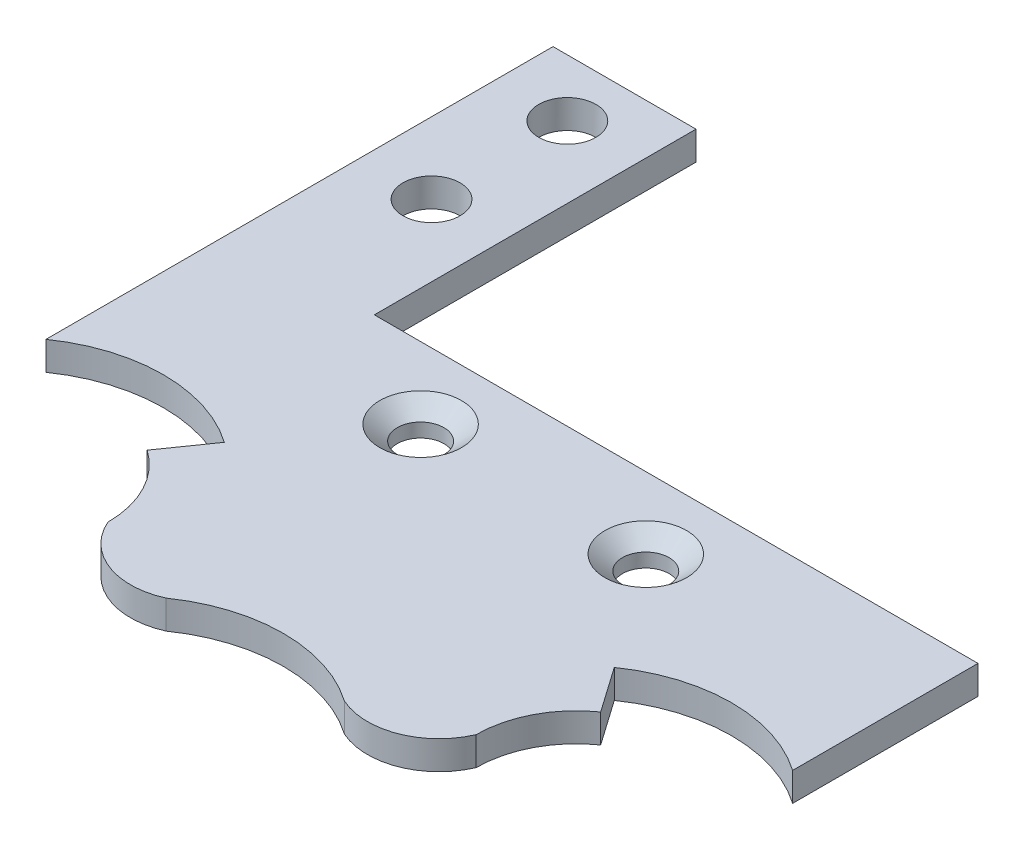
ISO-10303-21;
HEADER;
FILE_DESCRIPTION(('STEP AP214'),'2;1');
FILE_NAME('part.step','',(''),(''),'','','');
FILE_SCHEMA(('AUTOMOTIVE_DESIGN { 1 0 10303 214 1 1 1 1 }'));
ENDSEC;
DATA;
#1=APPLICATION_CONTEXT('core data for automotive mechanical design processes');
#2=APPLICATION_PROTOCOL_DEFINITION('international standard','automotive_design',2000,#1);
#3=PRODUCT_CONTEXT('',#1,'mechanical');
#4=PRODUCT('Part','Part','',(#3));
#5=PRODUCT_RELATED_PRODUCT_CATEGORY('part','',(#4));
#6=PRODUCT_DEFINITION_FORMATION('','',#4);
#7=PRODUCT_DEFINITION_CONTEXT('part definition',#1,'design');
#8=PRODUCT_DEFINITION('design','',#6,#7);
#9=PRODUCT_DEFINITION_SHAPE('','',#8);
#10=(LENGTH_UNIT() NAMED_UNIT(*) SI_UNIT(.MILLI.,.METRE.));
#11=(NAMED_UNIT(*) PLANE_ANGLE_UNIT() SI_UNIT($,.RADIAN.));
#12=(NAMED_UNIT(*) SI_UNIT($,.STERADIAN.) SOLID_ANGLE_UNIT());
#13=UNCERTAINTY_MEASURE_WITH_UNIT(LENGTH_MEASURE(1.E-05),#10,'distance_accuracy_value','');
#14=(GEOMETRIC_REPRESENTATION_CONTEXT(3) GLOBAL_UNCERTAINTY_ASSIGNED_CONTEXT((#13)) GLOBAL_UNIT_ASSIGNED_CONTEXT((#10,
#11,#12)) REPRESENTATION_CONTEXT('',''));
#15=CARTESIAN_POINT('',(0.,0.,0.));
#16=DIRECTION('',(0.,0.,1.));
#17=DIRECTION('',(1.,0.,0.));
#18=AXIS2_PLACEMENT_3D('',#15,#16,#17);
#19=CARTESIAN_POINT('',(-19.8752830168529,1.,-11.4749999999999));
#20=DIRECTION('',(0.,-1.,0.));
#21=DIRECTION('',(0.,0.,-1.));
#22=AXIS2_PLACEMENT_3D('',#19,#20,#21);
#23=PLANE('',#22);
#24=CARTESIAN_POINT('',(-7.87528301685294,1.,-28.3499999999999));
#25=DIRECTION('',(0.,-1.,0.));
#26=DIRECTION('',(0.,0.,-1.));
#27=AXIS2_PLACEMENT_3D('',#24,#25,#26);
#28=CIRCLE('',#27,1.63195);
#29=CARTESIAN_POINT('',(-7.87528301685294,1.,-29.9819499999999));
#30=VERTEX_POINT('',#29);
#31=EDGE_CURVE('E438',#30,#30,#28,.F.);
#32=ORIENTED_EDGE('',*,*,#31,.T.);
#33=EDGE_LOOP('',(#32));
#34=FACE_BOUND('',#33,.T.);
#35=CARTESIAN_POINT('',(-19.8752830168529,1.,-11.4749999999999));
#36=DIRECTION('',(0.,-1.,0.));
#37=DIRECTION('',(0.,0.,-1.));
#38=AXIS2_PLACEMENT_3D('',#35,#36,#37);
#39=CIRCLE('',#38,10.875);
#40=CARTESIAN_POINT('',(-26.1129267621705,1.,-20.3832784816427));
#41=VERTEX_POINT('',#40);
#42=CARTESIAN_POINT('',(-13.6376392715353,1.,-20.3832784816427));
#43=VERTEX_POINT('',#42);
#44=EDGE_CURVE('E128',#41,#43,#39,.T.);
#45=ORIENTED_EDGE('',*,*,#44,.F.);
#46=DIRECTION('',(0.,0.,-1.));
#47=VECTOR('',#46,1.);
#48=CARTESIAN_POINT('',(-26.1129267621705,1.,-11.4749999999999));
#49=LINE('',#48,#47);
#50=CARTESIAN_POINT('',(-26.1129267621705,1.,-55.8499999999999));
#51=VERTEX_POINT('',#50);
#52=EDGE_CURVE('E141',#51,#41,#49,.F.);
#53=ORIENTED_EDGE('',*,*,#52,.F.);
#54=DIRECTION('',(1.,0.,0.));
#55=VECTOR('',#54,1.);
#56=CARTESIAN_POINT('',(-19.8752830168529,1.,-55.8499999999999));
#57=LINE('',#56,#55);
#58=CARTESIAN_POINT('',(-16.1129267621705,1.,-55.8499999999999));
#59=VERTEX_POINT('',#58);
#60=EDGE_CURVE('E144',#59,#51,#57,.F.);
#61=ORIENTED_EDGE('',*,*,#60,.F.);
#62=DIRECTION('',(0.,0.,-1.));
#63=VECTOR('',#62,1.);
#64=CARTESIAN_POINT('',(-16.1129267621705,1.,-11.4749999999999));
#65=LINE('',#64,#63);
#66=CARTESIAN_POINT('',(-16.1129267621705,1.,-33.3499999999999));
#67=VERTEX_POINT('',#66);
#68=EDGE_CURVE('E147',#67,#59,#65,.T.);
#69=ORIENTED_EDGE('',*,*,#68,.F.);
#70=DIRECTION('',(1.,0.,0.));
#71=VECTOR('',#70,1.);
#72=CARTESIAN_POINT('',(-19.8752830168529,1.,-33.3499999999999));
#73=LINE('',#72,#71);
#74=CARTESIAN_POINT('',(26.1129267621705,1.,-33.3499999999999));
#75=VERTEX_POINT('',#74);
#76=EDGE_CURVE('E150',#75,#67,#73,.F.);
#77=ORIENTED_EDGE('',*,*,#76,.F.);
#78=DIRECTION('',(0.,0.,-1.));
#79=VECTOR('',#78,1.);
#80=CARTESIAN_POINT('',(26.1129267621705,1.,-11.4749999999999));
#81=LINE('',#80,#79);
#82=CARTESIAN_POINT('',(26.1129267621705,1.,-20.3832784816427));
#83=VERTEX_POINT('',#82);
#84=EDGE_CURVE('E153',#83,#75,#81,.T.);
#85=ORIENTED_EDGE('',*,*,#84,.F.);
#86=CARTESIAN_POINT('',(19.8752830168529,1.,-11.4749999999998));
#87=DIRECTION('',(0.,-1.,0.));
#88=DIRECTION('',(0.,0.,-1.));
#89=AXIS2_PLACEMENT_3D('',#86,#87,#88);
#90=CIRCLE('',#89,10.875);
#91=CARTESIAN_POINT('',(13.6376392715353,1.,-20.3832784816427));
#92=VERTEX_POINT('',#91);
#93=EDGE_CURVE('E156',#92,#83,#90,.T.);
#94=ORIENTED_EDGE('',*,*,#93,.F.);
#95=DIRECTION('',(-0.573576436351044,0.,-0.819152044288993));
#96=VECTOR('',#95,1.);
#97=CARTESIAN_POINT('',(15.8602479623956,1.,-17.2090643100228));
#98=LINE('',#97,#96);
#99=CARTESIAN_POINT('',(15.8602479623956,1.,-17.2090643100228));
#100=VERTEX_POINT('',#99);
#101=EDGE_CURVE('E159',#100,#92,#98,.T.);
#102=ORIENTED_EDGE('',*,*,#101,.F.);
#103=CARTESIAN_POINT('',(19.875283016853,1.,-11.4749999999998));
#104=DIRECTION('',(0.,-1.,0.));
#105=DIRECTION('',(0.,0.,-1.));
#106=AXIS2_PLACEMENT_3D('',#103,#104,#105);
#107=CIRCLE('',#106,7.0000000000001);
#108=CARTESIAN_POINT('',(12.8752830168529,1.,-11.4749999999998));
#109=VERTEX_POINT('',#108);
#110=EDGE_CURVE('E162',#109,#100,#107,.T.);
#111=ORIENTED_EDGE('',*,*,#110,.F.);
#112=CARTESIAN_POINT('',(8.28958586898089,1.,-13.4678325740005));
#113=DIRECTION('',(0.,1.,0.));
#114=DIRECTION('',(0.,0.,1.));
#115=AXIS2_PLACEMENT_3D('',#112,#113,#114);
#116=CIRCLE('',#115,5.00000000000001);
#117=CARTESIAN_POINT('',(6.23764374531759,1.,-8.90827848164279));
#118=VERTEX_POINT('',#117);
#119=EDGE_CURVE('E165',#118,#109,#116,.T.);
#120=ORIENTED_EDGE('',*,*,#119,.F.);
#121=CARTESIAN_POINT('',(0.,1.,0.));
#122=DIRECTION('',(0.,-1.,0.));
#123=DIRECTION('',(0.,0.,-1.));
#124=AXIS2_PLACEMENT_3D('',#121,#122,#123);
#125=CIRCLE('',#124,10.875);
#126=CARTESIAN_POINT('',(-6.23764374531761,1.,-8.90827848164279));
#127=VERTEX_POINT('',#126);
#128=EDGE_CURVE('E168',#127,#118,#125,.T.);
#129=ORIENTED_EDGE('',*,*,#128,.F.);
#130=CARTESIAN_POINT('',(-8.28958586898088,1.,-13.4678325740005));
#131=DIRECTION('',(0.,1.,0.));
#132=DIRECTION('',(0.,0.,1.));
#133=AXIS2_PLACEMENT_3D('',#130,#131,#132);
#134=CIRCLE('',#133,5.);
#135=CARTESIAN_POINT('',(-12.8752830168529,1.,-11.4749999999999));
#136=VERTEX_POINT('',#135);
#137=EDGE_CURVE('E171',#136,#127,#134,.T.);
#138=ORIENTED_EDGE('',*,*,#137,.F.);
#139=CARTESIAN_POINT('',(-19.875283016853,1.,-11.4749999999998));
#140=DIRECTION('',(0.,-1.,0.));
#141=DIRECTION('',(0.,0.,-1.));
#142=AXIS2_PLACEMENT_3D('',#139,#140,#141);
#143=CIRCLE('',#142,7.00000000000008);
#144=CARTESIAN_POINT('',(-15.8602479623956,1.,-17.2090643100228));
#145=VERTEX_POINT('',#144);
#146=EDGE_CURVE('E130',#145,#136,#143,.T.);
#147=ORIENTED_EDGE('',*,*,#146,.F.);
#148=DIRECTION('',(-0.573576436351044,0.,0.819152044288993));
#149=VECTOR('',#148,1.);
#150=CARTESIAN_POINT('',(-15.8602479623956,1.,-17.2090643100228));
#151=LINE('',#150,#149);
#152=EDGE_CURVE('E117',#43,#145,#151,.T.);
#153=ORIENTED_EDGE('',*,*,#152,.F.);
#154=EDGE_LOOP('',(#45,#53,#61,#69,#77,#85,#94,#102,#111,#120,#129,#138,#147,#153));
#155=FACE_BOUND('',#154,.T.);
#156=CARTESIAN_POINT('',(-21.1129267621705,1.,-42.3499999999999));
#157=DIRECTION('',(0.,-1.,0.));
#158=DIRECTION('',(0.,0.,-1.));
#159=AXIS2_PLACEMENT_3D('',#156,#157,#158);
#160=CIRCLE('',#159,2.00000000000001);
#161=CARTESIAN_POINT('',(-21.1129267621705,1.,-44.3499999999999));
#162=VERTEX_POINT('',#161);
#163=EDGE_CURVE('E446',#162,#162,#160,.F.);
#164=ORIENTED_EDGE('',*,*,#163,.T.);
#165=EDGE_LOOP('',(#164));
#166=FACE_BOUND('',#165,.T.);
#167=CARTESIAN_POINT('',(-21.1129267621705,1.,-51.8499999999999));
#168=DIRECTION('',(0.,-1.,0.));
#169=DIRECTION('',(0.,0.,-1.));
#170=AXIS2_PLACEMENT_3D('',#167,#168,#169);
#171=CIRCLE('',#170,2.00000000000001);
#172=CARTESIAN_POINT('',(-21.1129267621705,1.,-53.8499999999999));
#173=VERTEX_POINT('',#172);
#174=EDGE_CURVE('E133',#173,#173,#171,.F.);
#175=ORIENTED_EDGE('',*,*,#174,.T.);
#176=EDGE_LOOP('',(#175));
#177=FACE_BOUND('',#176,.T.);
#178=CARTESIAN_POINT('',(7.87528301685293,1.,-28.3499999999999));
#179=DIRECTION('',(0.,-1.,0.));
#180=DIRECTION('',(0.,0.,-1.));
#181=AXIS2_PLACEMENT_3D('',#178,#179,#180);
#182=CIRCLE('',#181,1.63195);
#183=CARTESIAN_POINT('',(7.87528301685293,1.,-29.9819499999999));
#184=VERTEX_POINT('',#183);
#185=EDGE_CURVE('E447',#184,#184,#182,.F.);
#186=ORIENTED_EDGE('',*,*,#185,.T.);
#187=EDGE_LOOP('',(#186));
#188=FACE_BOUND('',#187,.T.);
#189=ADVANCED_FACE('F45',(#34,#155,#166,#177,#188),#23,.T.);
#190=CARTESIAN_POINT('',(-19.875283016853,3.,-11.4749999999998));
#191=DIRECTION('',(0.,-1.,0.));
#192=DIRECTION('',(0.,0.,-1.));
#193=AXIS2_PLACEMENT_3D('',#190,#191,#192);
#194=CYLINDRICAL_SURFACE('',#193,7.00000000000008);
#195=DIRECTION('',(0.,1.,0.));
#196=VECTOR('',#195,1.);
#197=CARTESIAN_POINT('',(-15.8602479623956,3.,-17.2090643100228));
#198=LINE('',#197,#196);
#199=CARTESIAN_POINT('',(-15.8602479623956,3.,-17.2090643100228));
#200=VERTEX_POINT('',#199);
#201=EDGE_CURVE('E11',#145,#200,#198,.T.);
#202=ORIENTED_EDGE('',*,*,#201,.F.);
#203=ORIENTED_EDGE('',*,*,#146,.T.);
#204=DIRECTION('',(0.,1.,0.));
#205=VECTOR('',#204,1.);
#206=CARTESIAN_POINT('',(-12.8752830168529,3.,-11.4749999999999));
#207=LINE('',#206,#205);
#208=CARTESIAN_POINT('',(-12.8752830168529,3.,-11.4749999999999));
#209=VERTEX_POINT('',#208);
#210=EDGE_CURVE('E55',#136,#209,#207,.T.);
#211=ORIENTED_EDGE('',*,*,#210,.T.);
#212=CARTESIAN_POINT('',(-19.875283016853,3.,-11.4749999999998));
#213=DIRECTION('',(0.,-1.,0.));
#214=DIRECTION('',(0.,0.,-1.));
#215=AXIS2_PLACEMENT_3D('',#212,#213,#214);
#216=CIRCLE('',#215,7.00000000000008);
#217=EDGE_CURVE('E210',#200,#209,#216,.T.);
#218=ORIENTED_EDGE('',*,*,#217,.F.);
#219=EDGE_LOOP('',(#202,#203,#211,#218));
#220=FACE_BOUND('',#219,.T.);
#221=ADVANCED_FACE('F208',(#220),#194,.F.);
#222=CARTESIAN_POINT('',(-8.28958586898088,3.,-13.4678325740005));
#223=DIRECTION('',(0.,-1.,0.));
#224=DIRECTION('',(0.,0.,-1.));
#225=AXIS2_PLACEMENT_3D('',#222,#223,#224);
#226=CYLINDRICAL_SURFACE('',#225,5.);
#227=ORIENTED_EDGE('',*,*,#210,.F.);
#228=ORIENTED_EDGE('',*,*,#137,.T.);
#229=DIRECTION('',(0.,1.,0.));
#230=VECTOR('',#229,1.);
#231=CARTESIAN_POINT('',(-6.23764374531762,3.,-8.90827848164279));
#232=LINE('',#231,#230);
#233=CARTESIAN_POINT('',(-6.23764374531762,3.,-8.90827848164279));
#234=VERTEX_POINT('',#233);
#235=EDGE_CURVE('E202',#127,#234,#232,.T.);
#236=ORIENTED_EDGE('',*,*,#235,.T.);
#237=CARTESIAN_POINT('',(-8.28958586898088,3.,-13.4678325740005));
#238=DIRECTION('',(0.,1.,0.));
#239=DIRECTION('',(0.,0.,1.));
#240=AXIS2_PLACEMENT_3D('',#237,#238,#239);
#241=CIRCLE('',#240,5.);
#242=EDGE_CURVE('E219',#209,#234,#241,.T.);
#243=ORIENTED_EDGE('',*,*,#242,.F.);
#244=EDGE_LOOP('',(#227,#228,#236,#243));
#245=FACE_BOUND('',#244,.T.);
#246=ADVANCED_FACE('F222',(#245),#226,.T.);
#247=CARTESIAN_POINT('',(0.,3.,0.));
#248=DIRECTION('',(0.,-1.,0.));
#249=DIRECTION('',(0.,0.,-1.));
#250=AXIS2_PLACEMENT_3D('',#247,#248,#249);
#251=CYLINDRICAL_SURFACE('',#250,10.875);
#252=ORIENTED_EDGE('',*,*,#235,.F.);
#253=ORIENTED_EDGE('',*,*,#128,.T.);
#254=DIRECTION('',(0.,1.,0.));
#255=VECTOR('',#254,1.);
#256=CARTESIAN_POINT('',(6.2376437453176,3.,-8.90827848164279));
#257=LINE('',#256,#255);
#258=CARTESIAN_POINT('',(6.2376437453176,3.,-8.90827848164279));
#259=VERTEX_POINT('',#258);
#260=EDGE_CURVE('E199',#118,#259,#257,.T.);
#261=ORIENTED_EDGE('',*,*,#260,.T.);
#262=CARTESIAN_POINT('',(0.,3.,0.));
#263=DIRECTION('',(0.,-1.,0.));
#264=DIRECTION('',(0.,0.,-1.));
#265=AXIS2_PLACEMENT_3D('',#262,#263,#264);
#266=CIRCLE('',#265,10.875);
#267=EDGE_CURVE('E223',#234,#259,#266,.T.);
#268=ORIENTED_EDGE('',*,*,#267,.F.);
#269=EDGE_LOOP('',(#252,#253,#261,#268));
#270=FACE_BOUND('',#269,.T.);
#271=ADVANCED_FACE('F288',(#270),#251,.F.);
#272=CARTESIAN_POINT('',(8.28958586898089,3.,-13.4678325740005));
#273=DIRECTION('',(0.,-1.,0.));
#274=DIRECTION('',(0.,0.,-1.));
#275=AXIS2_PLACEMENT_3D('',#272,#273,#274);
#276=CYLINDRICAL_SURFACE('',#275,5.00000000000001);
#277=ORIENTED_EDGE('',*,*,#260,.F.);
#278=ORIENTED_EDGE('',*,*,#119,.T.);
#279=DIRECTION('',(0.,1.,0.));
#280=VECTOR('',#279,1.);
#281=CARTESIAN_POINT('',(12.8752830168529,3.,-11.4749999999998));
#282=LINE('',#281,#280);
#283=CARTESIAN_POINT('',(12.8752830168529,3.,-11.4749999999998));
#284=VERTEX_POINT('',#283);
#285=EDGE_CURVE('E196',#109,#284,#282,.T.);
#286=ORIENTED_EDGE('',*,*,#285,.T.);
#287=CARTESIAN_POINT('',(8.28958586898089,3.,-13.4678325740005));
#288=DIRECTION('',(0.,1.,0.));
#289=DIRECTION('',(0.,0.,1.));
#290=AXIS2_PLACEMENT_3D('',#287,#288,#289);
#291=CIRCLE('',#290,5.00000000000001);
#292=EDGE_CURVE('E225',#259,#284,#291,.T.);
#293=ORIENTED_EDGE('',*,*,#292,.F.);
#294=EDGE_LOOP('',(#277,#278,#286,#293));
#295=FACE_BOUND('',#294,.T.);
#296=ADVANCED_FACE('F294',(#295),#276,.T.);
#297=CARTESIAN_POINT('',(19.875283016853,3.,-11.4749999999998));
#298=DIRECTION('',(0.,-1.,0.));
#299=DIRECTION('',(0.,0.,-1.));
#300=AXIS2_PLACEMENT_3D('',#297,#298,#299);
#301=CYLINDRICAL_SURFACE('',#300,7.0000000000001);
#302=ORIENTED_EDGE('',*,*,#285,.F.);
#303=ORIENTED_EDGE('',*,*,#110,.T.);
#304=DIRECTION('',(0.,1.,0.));
#305=VECTOR('',#304,1.);
#306=CARTESIAN_POINT('',(15.8602479623956,3.,-17.2090643100228));
#307=LINE('',#306,#305);
#308=CARTESIAN_POINT('',(15.8602479623956,3.,-17.2090643100228));
#309=VERTEX_POINT('',#308);
#310=EDGE_CURVE('E193',#100,#309,#307,.T.);
#311=ORIENTED_EDGE('',*,*,#310,.T.);
#312=CARTESIAN_POINT('',(19.875283016853,3.,-11.4749999999998));
#313=DIRECTION('',(0.,-1.,0.));
#314=DIRECTION('',(0.,0.,-1.));
#315=AXIS2_PLACEMENT_3D('',#312,#313,#314);
#316=CIRCLE('',#315,7.0000000000001);
#317=EDGE_CURVE('E231',#284,#309,#316,.T.);
#318=ORIENTED_EDGE('',*,*,#317,.F.);
#319=EDGE_LOOP('',(#302,#303,#311,#318));
#320=FACE_BOUND('',#319,.T.);
#321=ADVANCED_FACE('F297',(#320),#301,.F.);
#322=CARTESIAN_POINT('',(15.8602479623956,3.,-17.2090643100228));
#323=DIRECTION('',(-0.819152044288993,0.,0.573576436351044));
#324=DIRECTION('',(-0.573576436351044,0.,-0.819152044288993));
#325=AXIS2_PLACEMENT_3D('',#322,#323,#324);
#326=PLANE('',#325);
#327=ORIENTED_EDGE('',*,*,#310,.F.);
#328=ORIENTED_EDGE('',*,*,#101,.T.);
#329=DIRECTION('',(0.,1.,0.));
#330=VECTOR('',#329,1.);
#331=CARTESIAN_POINT('',(13.6376392715353,3.,-20.3832784816427));
#332=LINE('',#331,#330);
#333=CARTESIAN_POINT('',(13.6376392715353,3.,-20.3832784816427));
#334=VERTEX_POINT('',#333);
#335=EDGE_CURVE('E190',#92,#334,#332,.T.);
#336=ORIENTED_EDGE('',*,*,#335,.T.);
#337=DIRECTION('',(-0.573576436351044,0.,-0.819152044288993));
#338=VECTOR('',#337,1.);
#339=CARTESIAN_POINT('',(15.8602479623956,3.,-17.2090643100228));
#340=LINE('',#339,#338);
#341=EDGE_CURVE('E234',#309,#334,#340,.T.);
#342=ORIENTED_EDGE('',*,*,#341,.F.);
#343=EDGE_LOOP('',(#327,#328,#336,#342));
#344=FACE_BOUND('',#343,.T.);
#345=ADVANCED_FACE('F301',(#344),#326,.F.);
#346=CARTESIAN_POINT('',(19.8752830168529,3.,-11.4749999999998));
#347=DIRECTION('',(0.,-1.,0.));
#348=DIRECTION('',(0.,0.,-1.));
#349=AXIS2_PLACEMENT_3D('',#346,#347,#348);
#350=CYLINDRICAL_SURFACE('',#349,10.875);
#351=ORIENTED_EDGE('',*,*,#335,.F.);
#352=ORIENTED_EDGE('',*,*,#93,.T.);
#353=DIRECTION('',(0.,1.,0.));
#354=VECTOR('',#353,1.);
#355=CARTESIAN_POINT('',(26.1129267621705,3.,-20.3832784816427));
#356=LINE('',#355,#354);
#357=CARTESIAN_POINT('',(26.1129267621705,3.,-20.3832784816427));
#358=VERTEX_POINT('',#357);
#359=EDGE_CURVE('E187',#83,#358,#356,.T.);
#360=ORIENTED_EDGE('',*,*,#359,.T.);
#361=CARTESIAN_POINT('',(19.8752830168529,3.,-11.4749999999998));
#362=DIRECTION('',(0.,-1.,0.));
#363=DIRECTION('',(0.,0.,-1.));
#364=AXIS2_PLACEMENT_3D('',#361,#362,#363);
#365=CIRCLE('',#364,10.875);
#366=EDGE_CURVE('E237',#334,#358,#365,.T.);
#367=ORIENTED_EDGE('',*,*,#366,.F.);
#368=EDGE_LOOP('',(#351,#352,#360,#367));
#369=FACE_BOUND('',#368,.T.);
#370=ADVANCED_FACE('F303',(#369),#350,.F.);
#371=CARTESIAN_POINT('',(26.1129267621705,3.,-33.3499999999999));
#372=DIRECTION('',(-1.,0.,0.));
#373=DIRECTION('',(0.,0.,-1.));
#374=AXIS2_PLACEMENT_3D('',#371,#372,#373);
#375=PLANE('',#374);
#376=ORIENTED_EDGE('',*,*,#359,.F.);
#377=ORIENTED_EDGE('',*,*,#84,.T.);
#378=DIRECTION('',(0.,1.,0.));
#379=VECTOR('',#378,1.);
#380=CARTESIAN_POINT('',(26.1129267621705,3.,-33.3499999999999));
#381=LINE('',#380,#379);
#382=CARTESIAN_POINT('',(26.1129267621705,3.,-33.3499999999999));
#383=VERTEX_POINT('',#382);
#384=EDGE_CURVE('E184',#75,#383,#381,.T.);
#385=ORIENTED_EDGE('',*,*,#384,.T.);
#386=DIRECTION('',(0.,0.,-1.));
#387=VECTOR('',#386,1.);
#388=CARTESIAN_POINT('',(26.1129267621705,3.,-33.3499999999999));
#389=LINE('',#388,#387);
#390=EDGE_CURVE('E240',#358,#383,#389,.T.);
#391=ORIENTED_EDGE('',*,*,#390,.F.);
#392=EDGE_LOOP('',(#376,#377,#385,#391));
#393=FACE_BOUND('',#392,.T.);
#394=ADVANCED_FACE('F272',(#393),#375,.F.);
#395=CARTESIAN_POINT('',(-16.1129267621705,3.,-33.3499999999999));
#396=DIRECTION('',(0.,0.,1.));
#397=DIRECTION('',(-1.,0.,0.));
#398=AXIS2_PLACEMENT_3D('',#395,#396,#397);
#399=PLANE('',#398);
#400=ORIENTED_EDGE('',*,*,#384,.F.);
#401=ORIENTED_EDGE('',*,*,#76,.T.);
#402=DIRECTION('',(0.,1.,0.));
#403=VECTOR('',#402,1.);
#404=CARTESIAN_POINT('',(-16.1129267621705,3.,-33.3499999999999));
#405=LINE('',#404,#403);
#406=CARTESIAN_POINT('',(-16.1129267621705,3.,-33.3499999999999));
#407=VERTEX_POINT('',#406);
#408=EDGE_CURVE('E181',#67,#407,#405,.T.);
#409=ORIENTED_EDGE('',*,*,#408,.T.);
#410=DIRECTION('',(-1.,0.,0.));
#411=VECTOR('',#410,1.);
#412=CARTESIAN_POINT('',(-16.1129267621705,3.,-33.3499999999999));
#413=LINE('',#412,#411);
#414=EDGE_CURVE('E243',#383,#407,#413,.T.);
#415=ORIENTED_EDGE('',*,*,#414,.F.);
#416=EDGE_LOOP('',(#400,#401,#409,#415));
#417=FACE_BOUND('',#416,.T.);
#418=ADVANCED_FACE('F264',(#417),#399,.F.);
#419=CARTESIAN_POINT('',(-16.1129267621705,3.,-55.8499999999999));
#420=DIRECTION('',(-1.,0.,0.));
#421=DIRECTION('',(0.,0.,-1.));
#422=AXIS2_PLACEMENT_3D('',#419,#420,#421);
#423=PLANE('',#422);
#424=ORIENTED_EDGE('',*,*,#408,.F.);
#425=ORIENTED_EDGE('',*,*,#68,.T.);
#426=DIRECTION('',(0.,1.,0.));
#427=VECTOR('',#426,1.);
#428=CARTESIAN_POINT('',(-16.1129267621705,3.,-55.8499999999999));
#429=LINE('',#428,#427);
#430=CARTESIAN_POINT('',(-16.1129267621705,3.,-55.8499999999999));
#431=VERTEX_POINT('',#430);
#432=EDGE_CURVE('E178',#59,#431,#429,.T.);
#433=ORIENTED_EDGE('',*,*,#432,.T.);
#434=DIRECTION('',(0.,0.,-1.));
#435=VECTOR('',#434,1.);
#436=CARTESIAN_POINT('',(-16.1129267621705,3.,-55.8499999999999));
#437=LINE('',#436,#435);
#438=EDGE_CURVE('E246',#407,#431,#437,.T.);
#439=ORIENTED_EDGE('',*,*,#438,.F.);
#440=EDGE_LOOP('',(#424,#425,#433,#439));
#441=FACE_BOUND('',#440,.T.);
#442=ADVANCED_FACE('F259',(#441),#423,.F.);
#443=CARTESIAN_POINT('',(-26.1129267621705,3.,-55.8499999999999));
#444=DIRECTION('',(0.,0.,1.));
#445=DIRECTION('',(-1.,0.,0.));
#446=AXIS2_PLACEMENT_3D('',#443,#444,#445);
#447=PLANE('',#446);
#448=ORIENTED_EDGE('',*,*,#432,.F.);
#449=ORIENTED_EDGE('',*,*,#60,.T.);
#450=DIRECTION('',(0.,1.,0.));
#451=VECTOR('',#450,1.);
#452=CARTESIAN_POINT('',(-26.1129267621705,3.,-55.8499999999999));
#453=LINE('',#452,#451);
#454=CARTESIAN_POINT('',(-26.1129267621705,3.,-55.8499999999999));
#455=VERTEX_POINT('',#454);
#456=EDGE_CURVE('E176',#51,#455,#453,.T.);
#457=ORIENTED_EDGE('',*,*,#456,.T.);
#458=DIRECTION('',(-1.,0.,0.));
#459=VECTOR('',#458,1.);
#460=CARTESIAN_POINT('',(-26.1129267621705,3.,-55.8499999999999));
#461=LINE('',#460,#459);
#462=EDGE_CURVE('E248',#431,#455,#461,.T.);
#463=ORIENTED_EDGE('',*,*,#462,.F.);
#464=EDGE_LOOP('',(#448,#449,#457,#463));
#465=FACE_BOUND('',#464,.T.);
#466=ADVANCED_FACE('F255',(#465),#447,.F.);
#467=CARTESIAN_POINT('',(-26.1129267621705,3.,-33.3499999999999));
#468=DIRECTION('',(1.,0.,0.));
#469=DIRECTION('',(0.,0.,1.));
#470=AXIS2_PLACEMENT_3D('',#467,#468,#469);
#471=PLANE('',#470);
#472=ORIENTED_EDGE('',*,*,#456,.F.);
#473=ORIENTED_EDGE('',*,*,#52,.T.);
#474=DIRECTION('',(0.,1.,0.));
#475=VECTOR('',#474,1.);
#476=CARTESIAN_POINT('',(-26.1129267621705,3.,-20.3832784816427));
#477=LINE('',#476,#475);
#478=CARTESIAN_POINT('',(-26.1129267621705,3.,-20.3832784816427));
#479=VERTEX_POINT('',#478);
#480=EDGE_CURVE('E63',#41,#479,#477,.T.);
#481=ORIENTED_EDGE('',*,*,#480,.T.);
#482=DIRECTION('',(0.,0.,1.));
#483=VECTOR('',#482,1.);
#484=CARTESIAN_POINT('',(-26.1129267621705,3.,-33.3499999999999));
#485=LINE('',#484,#483);
#486=EDGE_CURVE('E123',#455,#479,#485,.T.);
#487=ORIENTED_EDGE('',*,*,#486,.F.);
#488=EDGE_LOOP('',(#472,#473,#481,#487));
#489=FACE_BOUND('',#488,.T.);
#490=ADVANCED_FACE('F252',(#489),#471,.F.);
#491=CARTESIAN_POINT('',(-19.8752830168529,3.,-11.4749999999999));
#492=DIRECTION('',(0.,-1.,0.));
#493=DIRECTION('',(0.,0.,-1.));
#494=AXIS2_PLACEMENT_3D('',#491,#492,#493);
#495=CYLINDRICAL_SURFACE('',#494,10.875);
#496=ORIENTED_EDGE('',*,*,#480,.F.);
#497=ORIENTED_EDGE('',*,*,#44,.T.);
#498=DIRECTION('',(0.,1.,0.));
#499=VECTOR('',#498,1.);
#500=CARTESIAN_POINT('',(-13.6376392715353,3.,-20.3832784816427));
#501=LINE('',#500,#499);
#502=CARTESIAN_POINT('',(-13.6376392715353,3.,-20.3832784816427));
#503=VERTEX_POINT('',#502);
#504=EDGE_CURVE('E49',#43,#503,#501,.T.);
#505=ORIENTED_EDGE('',*,*,#504,.T.);
#506=CARTESIAN_POINT('',(-19.8752830168529,3.,-11.4749999999999));
#507=DIRECTION('',(0.,-1.,0.));
#508=DIRECTION('',(0.,0.,-1.));
#509=AXIS2_PLACEMENT_3D('',#506,#507,#508);
#510=CIRCLE('',#509,10.875);
#511=EDGE_CURVE('E143',#479,#503,#510,.T.);
#512=ORIENTED_EDGE('',*,*,#511,.F.);
#513=EDGE_LOOP('',(#496,#497,#505,#512));
#514=FACE_BOUND('',#513,.T.);
#515=ADVANCED_FACE('F132',(#514),#495,.F.);
#516=CARTESIAN_POINT('',(-15.8602479623956,3.,-17.2090643100228));
#517=DIRECTION('',(0.819152044288993,0.,0.573576436351044));
#518=DIRECTION('',(-0.573576436351044,0.,0.819152044288993));
#519=AXIS2_PLACEMENT_3D('',#516,#517,#518);
#520=PLANE('',#519);
#521=ORIENTED_EDGE('',*,*,#152,.T.);
#522=ORIENTED_EDGE('',*,*,#201,.T.);
#523=DIRECTION('',(-0.573576436351044,0.,0.819152044288993));
#524=VECTOR('',#523,1.);
#525=CARTESIAN_POINT('',(-15.8602479623956,3.,-17.2090643100228));
#526=LINE('',#525,#524);
#527=EDGE_CURVE('E119',#503,#200,#526,.T.);
#528=ORIENTED_EDGE('',*,*,#527,.F.);
#529=ORIENTED_EDGE('',*,*,#504,.F.);
#530=EDGE_LOOP('',(#521,#522,#528,#529));
#531=FACE_BOUND('',#530,.T.);
#532=ADVANCED_FACE('F47',(#531),#520,.F.);
#533=CARTESIAN_POINT('',(-19.8752830168529,3.,-11.4749999999999));
#534=DIRECTION('',(0.,-1.,0.));
#535=DIRECTION('',(0.,0.,-1.));
#536=AXIS2_PLACEMENT_3D('',#533,#534,#535);
#537=PLANE('',#536);
#538=CARTESIAN_POINT('',(-7.87528301685294,3.,-28.3499999999999));
#539=DIRECTION('',(0.,1.,0.));
#540=DIRECTION('',(0.,0.,1.));
#541=AXIS2_PLACEMENT_3D('',#538,#539,#540);
#542=CIRCLE('',#541,2.8575);
#543=CARTESIAN_POINT('',(-7.87528301685294,3.,-25.4924999999999));
#544=VERTEX_POINT('',#543);
#545=EDGE_CURVE('E436',#544,#544,#542,.T.);
#546=ORIENTED_EDGE('',*,*,#545,.F.);
#547=EDGE_LOOP('',(#546));
#548=FACE_BOUND('',#547,.T.);
#549=CARTESIAN_POINT('',(7.87528301685293,3.,-28.3499999999999));
#550=DIRECTION('',(0.,1.,0.));
#551=DIRECTION('',(0.,0.,1.));
#552=AXIS2_PLACEMENT_3D('',#549,#550,#551);
#553=CIRCLE('',#552,2.8575);
#554=CARTESIAN_POINT('',(7.87528301685293,3.,-25.4924999999999));
#555=VERTEX_POINT('',#554);
#556=EDGE_CURVE('E448',#555,#555,#553,.T.);
#557=ORIENTED_EDGE('',*,*,#556,.F.);
#558=EDGE_LOOP('',(#557));
#559=FACE_BOUND('',#558,.T.);
#560=CARTESIAN_POINT('',(-21.1129267621705,3.,-51.8499999999999));
#561=DIRECTION('',(0.,1.,0.));
#562=DIRECTION('',(0.,0.,1.));
#563=AXIS2_PLACEMENT_3D('',#560,#561,#562);
#564=CIRCLE('',#563,2.00000000000001);
#565=CARTESIAN_POINT('',(-21.1129267621705,3.,-49.8499999999999));
#566=VERTEX_POINT('',#565);
#567=EDGE_CURVE('E136',#566,#566,#564,.T.);
#568=ORIENTED_EDGE('',*,*,#567,.F.);
#569=EDGE_LOOP('',(#568));
#570=FACE_BOUND('',#569,.T.);
#571=CARTESIAN_POINT('',(-21.1129267621705,3.,-42.3499999999999));
#572=DIRECTION('',(0.,1.,0.));
#573=DIRECTION('',(0.,0.,1.));
#574=AXIS2_PLACEMENT_3D('',#571,#572,#573);
#575=CIRCLE('',#574,2.00000000000001);
#576=CARTESIAN_POINT('',(-21.1129267621705,3.,-40.3499999999999));
#577=VERTEX_POINT('',#576);
#578=EDGE_CURVE('E454',#577,#577,#575,.T.);
#579=ORIENTED_EDGE('',*,*,#578,.F.);
#580=EDGE_LOOP('',(#579));
#581=FACE_BOUND('',#580,.T.);
#582=ORIENTED_EDGE('',*,*,#511,.T.);
#583=ORIENTED_EDGE('',*,*,#527,.T.);
#584=ORIENTED_EDGE('',*,*,#217,.T.);
#585=ORIENTED_EDGE('',*,*,#242,.T.);
#586=ORIENTED_EDGE('',*,*,#267,.T.);
#587=ORIENTED_EDGE('',*,*,#292,.T.);
#588=ORIENTED_EDGE('',*,*,#317,.T.);
#589=ORIENTED_EDGE('',*,*,#341,.T.);
#590=ORIENTED_EDGE('',*,*,#366,.T.);
#591=ORIENTED_EDGE('',*,*,#390,.T.);
#592=ORIENTED_EDGE('',*,*,#414,.T.);
#593=ORIENTED_EDGE('',*,*,#438,.T.);
#594=ORIENTED_EDGE('',*,*,#462,.T.);
#595=ORIENTED_EDGE('',*,*,#486,.T.);
#596=EDGE_LOOP('',(#582,#583,#584,#585,#586,#587,#588,#589,#590,#591,#592,#593,#594,#595));
#597=FACE_BOUND('',#596,.T.);
#598=ADVANCED_FACE('F217',(#548,#559,#570,#581,#597),#537,.F.);
#599=CARTESIAN_POINT('',(-21.1129267621705,-4.6568542494924,-42.3499999999999));
#600=DIRECTION('',(0.,1.,0.));
#601=DIRECTION('',(0.,0.,1.));
#602=AXIS2_PLACEMENT_3D('',#599,#600,#601);
#603=CYLINDRICAL_SURFACE('',#602,2.00000000000001);
#604=ORIENTED_EDGE('',*,*,#578,.T.);
#605=EDGE_LOOP('',(#604));
#606=FACE_BOUND('',#605,.T.);
#607=ORIENTED_EDGE('',*,*,#163,.F.);
#608=EDGE_LOOP('',(#607));
#609=FACE_BOUND('',#608,.T.);
#610=ADVANCED_FACE('F368',(#606,#609),#603,.F.);
#611=CARTESIAN_POINT('',(-21.1129267621705,-4.6568542494924,-51.8499999999999));
#612=DIRECTION('',(0.,1.,0.));
#613=DIRECTION('',(0.,0.,1.));
#614=AXIS2_PLACEMENT_3D('',#611,#612,#613);
#615=CYLINDRICAL_SURFACE('',#614,2.00000000000001);
#616=ORIENTED_EDGE('',*,*,#567,.T.);
#617=EDGE_LOOP('',(#616));
#618=FACE_BOUND('',#617,.T.);
#619=ORIENTED_EDGE('',*,*,#174,.F.);
#620=EDGE_LOOP('',(#619));
#621=FACE_BOUND('',#620,.T.);
#622=ADVANCED_FACE('F371',(#618,#621),#615,.F.);
#623=CARTESIAN_POINT('',(7.87528301685293,3.,-28.3499999999999));
#624=DIRECTION('',(0.,1.,0.));
#625=DIRECTION('',(0.,0.,1.));
#626=AXIS2_PLACEMENT_3D('',#623,#624,#625);
#627=CYLINDRICAL_SURFACE('',#626,1.63195);
#628=ORIENTED_EDGE('',*,*,#185,.F.);
#629=EDGE_LOOP('',(#628));
#630=FACE_BOUND('',#629,.T.);
#631=CARTESIAN_POINT('',(7.87528301685293,1.97164144701069,-28.3499999999999));
#632=DIRECTION('',(0.,1.,0.));
#633=DIRECTION('',(0.,0.,1.));
#634=AXIS2_PLACEMENT_3D('',#631,#632,#633);
#635=CIRCLE('',#634,1.63195);
#636=CARTESIAN_POINT('',(7.87528301685293,1.97164144701069,-26.7180499999999));
#637=VERTEX_POINT('',#636);
#638=EDGE_CURVE('E443',#637,#637,#635,.T.);
#639=ORIENTED_EDGE('',*,*,#638,.T.);
#640=EDGE_LOOP('',(#639));
#641=FACE_BOUND('',#640,.T.);
#642=ADVANCED_FACE('F378',(#630,#641),#627,.F.);
#643=CARTESIAN_POINT('',(7.87528301685293,3.,-28.3499999999999));
#644=DIRECTION('',(0.,1.,0.));
#645=DIRECTION('',(0.,0.,1.));
#646=AXIS2_PLACEMENT_3D('',#643,#644,#645);
#647=CONICAL_SURFACE('',#646,2.8575,0.872664625997165);
#648=ORIENTED_EDGE('',*,*,#638,.F.);
#649=EDGE_LOOP('',(#648));
#650=FACE_BOUND('',#649,.T.);
#651=ORIENTED_EDGE('',*,*,#556,.T.);
#652=EDGE_LOOP('',(#651));
#653=FACE_BOUND('',#652,.T.);
#654=ADVANCED_FACE('F397',(#650,#653),#647,.F.);
#655=CARTESIAN_POINT('',(-7.87528301685294,3.,-28.3499999999999));
#656=DIRECTION('',(0.,1.,0.));
#657=DIRECTION('',(0.,0.,1.));
#658=AXIS2_PLACEMENT_3D('',#655,#656,#657);
#659=CYLINDRICAL_SURFACE('',#658,1.63195);
#660=ORIENTED_EDGE('',*,*,#31,.F.);
#661=EDGE_LOOP('',(#660));
#662=FACE_BOUND('',#661,.T.);
#663=CARTESIAN_POINT('',(-7.87528301685294,1.97164144701069,-28.3499999999999));
#664=DIRECTION('',(0.,1.,0.));
#665=DIRECTION('',(0.,0.,1.));
#666=AXIS2_PLACEMENT_3D('',#663,#664,#665);
#667=CIRCLE('',#666,1.63195);
#668=CARTESIAN_POINT('',(-7.87528301685294,1.97164144701069,-26.7180499999999));
#669=VERTEX_POINT('',#668);
#670=EDGE_CURVE('E433',#669,#669,#667,.T.);
#671=ORIENTED_EDGE('',*,*,#670,.T.);
#672=EDGE_LOOP('',(#671));
#673=FACE_BOUND('',#672,.T.);
#674=ADVANCED_FACE('F407',(#662,#673),#659,.F.);
#675=CARTESIAN_POINT('',(-7.87528301685294,3.,-28.3499999999999));
#676=DIRECTION('',(0.,1.,0.));
#677=DIRECTION('',(0.,0.,1.));
#678=AXIS2_PLACEMENT_3D('',#675,#676,#677);
#679=CONICAL_SURFACE('',#678,2.8575,0.872664625997165);
#680=ORIENTED_EDGE('',*,*,#670,.F.);
#681=EDGE_LOOP('',(#680));
#682=FACE_BOUND('',#681,.T.);
#683=ORIENTED_EDGE('',*,*,#545,.T.);
#684=EDGE_LOOP('',(#683));
#685=FACE_BOUND('',#684,.T.);
#686=ADVANCED_FACE('F417',(#682,#685),#679,.F.);
#687=CLOSED_SHELL('',(#189,#221,#246,#271,#296,#321,#345,#370,#394,#418,#442,#466,#490,#515,
#532,#598,#610,#622,#642,#654,#674,#686));
#688=MANIFOLD_SOLID_BREP('B2',#687);
#689=ADVANCED_BREP_SHAPE_REPRESENTATION('',(#18,#688),#14);
#690=SHAPE_DEFINITION_REPRESENTATION(#9,#689);
ENDSEC;
END-ISO-10303-21;
